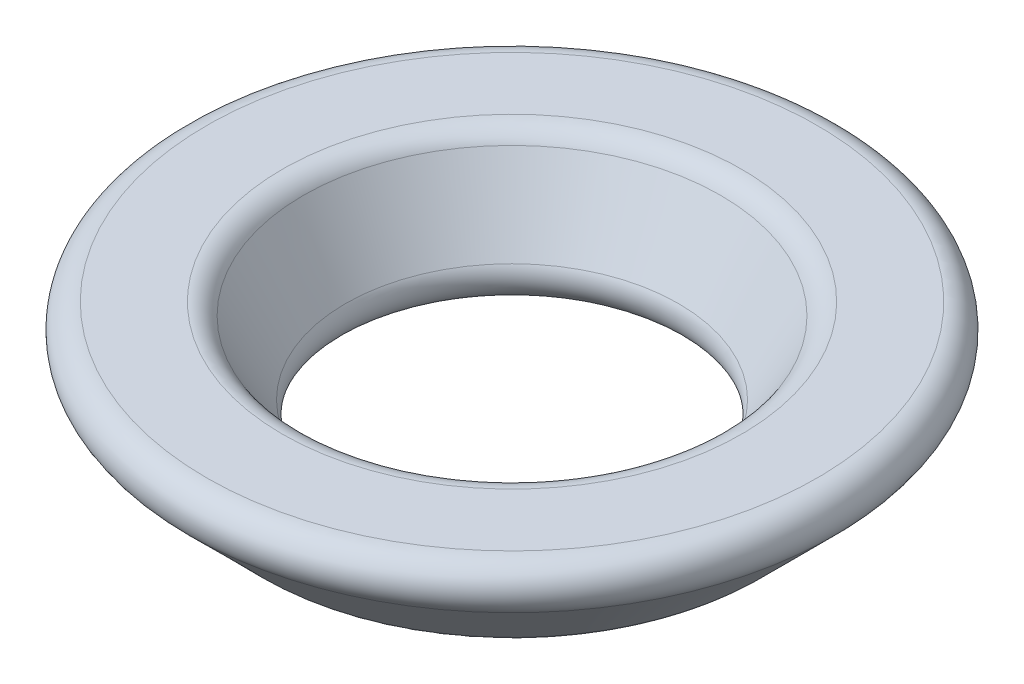
ISO-10303-21;
HEADER;
FILE_DESCRIPTION(('STEP AP214'),'2;1');
FILE_NAME('part.step','',(''),(''),'','','');
FILE_SCHEMA(('AUTOMOTIVE_DESIGN { 1 0 10303 214 1 1 1 1 }'));
ENDSEC;
DATA;
#1=APPLICATION_CONTEXT('core data for automotive mechanical design processes');
#2=APPLICATION_PROTOCOL_DEFINITION('international standard','automotive_design',2000,#1);
#3=PRODUCT_CONTEXT('',#1,'mechanical');
#4=PRODUCT('Part','Part','',(#3));
#5=PRODUCT_RELATED_PRODUCT_CATEGORY('part','',(#4));
#6=PRODUCT_DEFINITION_FORMATION('','',#4);
#7=PRODUCT_DEFINITION_CONTEXT('part definition',#1,'design');
#8=PRODUCT_DEFINITION('design','',#6,#7);
#9=PRODUCT_DEFINITION_SHAPE('','',#8);
#10=(LENGTH_UNIT() NAMED_UNIT(*) SI_UNIT(.MILLI.,.METRE.));
#11=(NAMED_UNIT(*) PLANE_ANGLE_UNIT() SI_UNIT($,.RADIAN.));
#12=(NAMED_UNIT(*) SI_UNIT($,.STERADIAN.) SOLID_ANGLE_UNIT());
#13=UNCERTAINTY_MEASURE_WITH_UNIT(LENGTH_MEASURE(1.E-05),#10,'distance_accuracy_value','');
#14=(GEOMETRIC_REPRESENTATION_CONTEXT(3) GLOBAL_UNCERTAINTY_ASSIGNED_CONTEXT((#13)) GLOBAL_UNIT_ASSIGNED_CONTEXT((#10,
#11,#12)) REPRESENTATION_CONTEXT('',''));
#15=CARTESIAN_POINT('',(0.,0.,0.));
#16=DIRECTION('',(0.,0.,1.));
#17=DIRECTION('',(1.,0.,0.));
#18=AXIS2_PLACEMENT_3D('',#15,#16,#17);
#19=CARTESIAN_POINT('',(-7.62,0.,0.));
#20=DIRECTION('',(0.,-1.,0.));
#21=DIRECTION('',(0.,0.,-1.));
#22=AXIS2_PLACEMENT_3D('',#19,#20,#21);
#23=PLANE('',#22);
#24=CARTESIAN_POINT('',(0.,0.,0.));
#25=DIRECTION('',(0.,-1.,0.));
#26=DIRECTION('',(0.,0.,-1.));
#27=AXIS2_PLACEMENT_3D('',#24,#25,#26);
#28=CIRCLE('',#27,12.1739487757862);
#29=CARTESIAN_POINT('',(0.,0.,-12.1739487757862));
#30=VERTEX_POINT('',#29);
#31=EDGE_CURVE('E51',#30,#30,#28,.T.);
#32=ORIENTED_EDGE('',*,*,#31,.T.);
#33=EDGE_LOOP('',(#32));
#34=FACE_BOUND('',#33,.T.);
#35=CARTESIAN_POINT('',(0.,0.,0.));
#36=DIRECTION('',(0.,-1.,0.));
#37=DIRECTION('',(0.,0.,-1.));
#38=AXIS2_PLACEMENT_3D('',#35,#36,#37);
#39=CIRCLE('',#38,9.81970452561247);
#40=CARTESIAN_POINT('',(0.,0.,-9.81970452561247));
#41=VERTEX_POINT('',#40);
#42=EDGE_CURVE('E54',#41,#41,#39,.F.);
#43=ORIENTED_EDGE('',*,*,#42,.T.);
#44=EDGE_LOOP('',(#43));
#45=FACE_BOUND('',#44,.T.);
#46=ADVANCED_FACE('F31',(#34,#45),#23,.T.);
#47=CARTESIAN_POINT('',(0.,0.,0.));
#48=DIRECTION('',(0.,1.,0.));
#49=DIRECTION('',(0.,0.,1.));
#50=AXIS2_PLACEMENT_3D('',#47,#48,#49);
#51=CONICAL_SURFACE('',#50,7.62,0.523598775598296);
#52=CARTESIAN_POINT('',(0.,1.905,0.));
#53=DIRECTION('',(0.,-1.,0.));
#54=DIRECTION('',(0.,0.,-1.));
#55=AXIS2_PLACEMENT_3D('',#52,#53,#54);
#56=CIRCLE('',#55,8.71985226280623);
#57=CARTESIAN_POINT('',(0.,1.905,-8.71985226280623));
#58=VERTEX_POINT('',#57);
#59=EDGE_CURVE('E10',#58,#58,#56,.T.);
#60=ORIENTED_EDGE('',*,*,#59,.T.);
#61=EDGE_LOOP('',(#60));
#62=FACE_BOUND('',#61,.T.);
#63=CARTESIAN_POINT('',(0.,5.71499999999999,0.));
#64=DIRECTION('',(0.,-1.,0.));
#65=DIRECTION('',(0.,0.,-1.));
#66=AXIS2_PLACEMENT_3D('',#63,#64,#65);
#67=CIRCLE('',#66,10.9195567884187);
#68=CARTESIAN_POINT('',(0.,5.71499999999999,-10.9195567884187));
#69=VERTEX_POINT('',#68);
#70=EDGE_CURVE('E38',#69,#69,#67,.F.);
#71=ORIENTED_EDGE('',*,*,#70,.T.);
#72=EDGE_LOOP('',(#71));
#73=FACE_BOUND('',#72,.T.);
#74=ADVANCED_FACE('F77',(#62,#73),#51,.F.);
#75=CARTESIAN_POINT('',(-19.05,6.35,0.));
#76=DIRECTION('',(0.,1.,0.));
#77=DIRECTION('',(0.,0.,1.));
#78=AXIS2_PLACEMENT_3D('',#75,#76,#77);
#79=PLANE('',#78);
#80=CARTESIAN_POINT('',(0.,6.35,0.));
#81=DIRECTION('',(0.,1.,0.));
#82=DIRECTION('',(0.,0.,1.));
#83=AXIS2_PLACEMENT_3D('',#80,#81,#82);
#84=CIRCLE('',#83,15.9839487757862);
#85=CARTESIAN_POINT('',(0.,6.35,15.9839487757862));
#86=VERTEX_POINT('',#85);
#87=EDGE_CURVE('E42',#86,#86,#84,.T.);
#88=ORIENTED_EDGE('',*,*,#87,.T.);
#89=EDGE_LOOP('',(#88));
#90=FACE_BOUND('',#89,.T.);
#91=CARTESIAN_POINT('',(0.,6.35,0.));
#92=DIRECTION('',(0.,1.,0.));
#93=DIRECTION('',(0.,0.,1.));
#94=AXIS2_PLACEMENT_3D('',#91,#92,#93);
#95=CIRCLE('',#94,12.0194090512249);
#96=CARTESIAN_POINT('',(0.,6.35,12.0194090512249));
#97=VERTEX_POINT('',#96);
#98=EDGE_CURVE('E46',#97,#97,#95,.F.);
#99=ORIENTED_EDGE('',*,*,#98,.T.);
#100=EDGE_LOOP('',(#99));
#101=FACE_BOUND('',#100,.T.);
#102=ADVANCED_FACE('F74',(#90,#101),#79,.T.);
#103=CARTESIAN_POINT('',(0.,6.35,0.));
#104=DIRECTION('',(0.,1.,0.));
#105=DIRECTION('',(0.,0.,1.));
#106=AXIS2_PLACEMENT_3D('',#103,#104,#105);
#107=CONICAL_SURFACE('',#106,19.05,0.785398163397447);
#108=CARTESIAN_POINT('',(0.,0.371974387893086,0.));
#109=DIRECTION('',(0.,-1.,0.));
#110=DIRECTION('',(0.,0.,-1.));
#111=AXIS2_PLACEMENT_3D('',#108,#109,#110);
#112=CIRCLE('',#111,13.0719743878931);
#113=CARTESIAN_POINT('',(0.,0.371974387893086,-13.0719743878931));
#114=VERTEX_POINT('',#113);
#115=EDGE_CURVE('E57',#114,#114,#112,.F.);
#116=ORIENTED_EDGE('',*,*,#115,.T.);
#117=EDGE_LOOP('',(#116));
#118=FACE_BOUND('',#117,.T.);
#119=CARTESIAN_POINT('',(0.,4.18197438789308,0.));
#120=DIRECTION('',(0.,-1.,0.));
#121=DIRECTION('',(0.,0.,-1.));
#122=AXIS2_PLACEMENT_3D('',#119,#120,#121);
#123=CIRCLE('',#122,16.8819743878931);
#124=CARTESIAN_POINT('',(0.,4.18197438789308,-16.8819743878931));
#125=VERTEX_POINT('',#124);
#126=EDGE_CURVE('E60',#125,#125,#123,.T.);
#127=ORIENTED_EDGE('',*,*,#126,.T.);
#128=EDGE_LOOP('',(#127));
#129=FACE_BOUND('',#128,.T.);
#130=ADVANCED_FACE('F64',(#118,#129),#107,.T.);
#131=CARTESIAN_POINT('',(0.,1.27,0.));
#132=DIRECTION('',(0.,-1.,0.));
#133=DIRECTION('',(0.,0.,-1.));
#134=AXIS2_PLACEMENT_3D('',#131,#132,#133);
#135=TOROIDAL_SURFACE('',#134,12.1739487757862,1.27);
#136=ORIENTED_EDGE('',*,*,#31,.F.);
#137=EDGE_LOOP('',(#136));
#138=FACE_BOUND('',#137,.T.);
#139=ORIENTED_EDGE('',*,*,#115,.F.);
#140=EDGE_LOOP('',(#139));
#141=FACE_BOUND('',#140,.T.);
#142=ADVANCED_FACE('F70',(#138,#141),#135,.T.);
#143=CARTESIAN_POINT('',(0.,5.08,0.));
#144=DIRECTION('',(0.,1.,0.));
#145=DIRECTION('',(0.,0.,1.));
#146=AXIS2_PLACEMENT_3D('',#143,#144,#145);
#147=TOROIDAL_SURFACE('',#146,15.9839487757862,1.27);
#148=ORIENTED_EDGE('',*,*,#126,.F.);
#149=EDGE_LOOP('',(#148));
#150=FACE_BOUND('',#149,.T.);
#151=ORIENTED_EDGE('',*,*,#87,.F.);
#152=EDGE_LOOP('',(#151));
#153=FACE_BOUND('',#152,.T.);
#154=ADVANCED_FACE('F66',(#150,#153),#147,.T.);
#155=CARTESIAN_POINT('',(0.,1.27,0.));
#156=DIRECTION('',(0.,-1.,0.));
#157=DIRECTION('',(0.,0.,-1.));
#158=AXIS2_PLACEMENT_3D('',#155,#156,#157);
#159=TOROIDAL_SURFACE('',#158,9.81970452561247,1.27);
#160=ORIENTED_EDGE('',*,*,#59,.F.);
#161=EDGE_LOOP('',(#160));
#162=FACE_BOUND('',#161,.T.);
#163=ORIENTED_EDGE('',*,*,#42,.F.);
#164=EDGE_LOOP('',(#163));
#165=FACE_BOUND('',#164,.T.);
#166=ADVANCED_FACE('F69',(#162,#165),#159,.T.);
#167=CARTESIAN_POINT('',(0.,5.08,0.));
#168=DIRECTION('',(0.,1.,0.));
#169=DIRECTION('',(0.,0.,1.));
#170=AXIS2_PLACEMENT_3D('',#167,#168,#169);
#171=TOROIDAL_SURFACE('',#170,12.0194090512249,1.27);
#172=ORIENTED_EDGE('',*,*,#98,.F.);
#173=EDGE_LOOP('',(#172));
#174=FACE_BOUND('',#173,.T.);
#175=ORIENTED_EDGE('',*,*,#70,.F.);
#176=EDGE_LOOP('',(#175));
#177=FACE_BOUND('',#176,.T.);
#178=ADVANCED_FACE('F33',(#174,#177),#171,.T.);
#179=CLOSED_SHELL('',(#46,#74,#102,#130,#142,#154,#166,#178));
#180=MANIFOLD_SOLID_BREP('B2',#179);
#181=ADVANCED_BREP_SHAPE_REPRESENTATION('',(#18,#180),#14);
#182=SHAPE_DEFINITION_REPRESENTATION(#9,#181);
ENDSEC;
END-ISO-10303-21;
